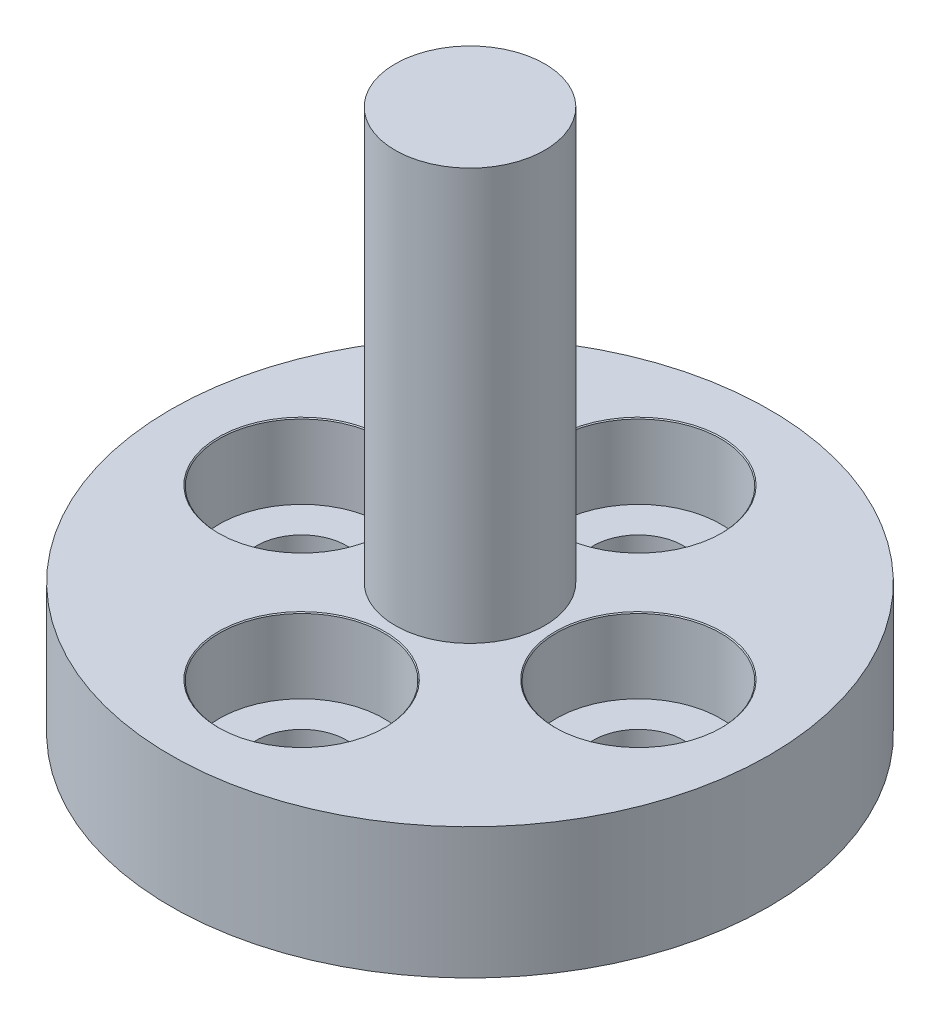
ISO-10303-21;
HEADER;
FILE_DESCRIPTION(('STEP AP214'),'2;1');
FILE_NAME('part.step','',(''),(''),'','','');
FILE_SCHEMA(('AUTOMOTIVE_DESIGN { 1 0 10303 214 1 1 1 1 }'));
ENDSEC;
DATA;
#1=APPLICATION_CONTEXT('core data for automotive mechanical design processes');
#2=APPLICATION_PROTOCOL_DEFINITION('international standard','automotive_design',2000,#1);
#3=PRODUCT_CONTEXT('',#1,'mechanical');
#4=PRODUCT('Part','Part','',(#3));
#5=PRODUCT_RELATED_PRODUCT_CATEGORY('part','',(#4));
#6=PRODUCT_DEFINITION_FORMATION('','',#4);
#7=PRODUCT_DEFINITION_CONTEXT('part definition',#1,'design');
#8=PRODUCT_DEFINITION('design','',#6,#7);
#9=PRODUCT_DEFINITION_SHAPE('','',#8);
#10=(LENGTH_UNIT() NAMED_UNIT(*) SI_UNIT(.MILLI.,.METRE.));
#11=(NAMED_UNIT(*) PLANE_ANGLE_UNIT() SI_UNIT($,.RADIAN.));
#12=(NAMED_UNIT(*) SI_UNIT($,.STERADIAN.) SOLID_ANGLE_UNIT());
#13=UNCERTAINTY_MEASURE_WITH_UNIT(LENGTH_MEASURE(1.E-05),#10,'distance_accuracy_value','');
#14=(GEOMETRIC_REPRESENTATION_CONTEXT(3) GLOBAL_UNCERTAINTY_ASSIGNED_CONTEXT((#13)) GLOBAL_UNIT_ASSIGNED_CONTEXT((#10,
#11,#12)) REPRESENTATION_CONTEXT('',''));
#15=CARTESIAN_POINT('',(0.,0.,0.));
#16=DIRECTION('',(0.,0.,1.));
#17=DIRECTION('',(1.,0.,0.));
#18=AXIS2_PLACEMENT_3D('',#15,#16,#17);
#19=CARTESIAN_POINT('',(0.,0.,0.));
#20=DIRECTION('',(0.,1.,0.));
#21=DIRECTION('',(-1.,0.,0.));
#22=AXIS2_PLACEMENT_3D('',#19,#20,#21);
#23=PLANE('',#22);
#24=CARTESIAN_POINT('',(-4.5,0.,0.));
#25=DIRECTION('',(0.,1.,0.));
#26=DIRECTION('',(0.,0.,1.));
#27=AXIS2_PLACEMENT_3D('',#24,#25,#26);
#28=CIRCLE('',#27,1.2);
#29=CARTESIAN_POINT('',(-4.5,0.,1.2));
#30=VERTEX_POINT('',#29);
#31=EDGE_CURVE('E101',#30,#30,#28,.T.);
#32=ORIENTED_EDGE('',*,*,#31,.T.);
#33=EDGE_LOOP('',(#32));
#34=FACE_BOUND('',#33,.T.);
#35=CARTESIAN_POINT('',(0.,0.,-4.5));
#36=DIRECTION('',(0.,1.,0.));
#37=DIRECTION('',(0.,0.,1.));
#38=AXIS2_PLACEMENT_3D('',#35,#36,#37);
#39=CIRCLE('',#38,1.2);
#40=CARTESIAN_POINT('',(0.,0.,-3.3));
#41=VERTEX_POINT('',#40);
#42=EDGE_CURVE('E86',#41,#41,#39,.T.);
#43=ORIENTED_EDGE('',*,*,#42,.T.);
#44=EDGE_LOOP('',(#43));
#45=FACE_BOUND('',#44,.T.);
#46=CARTESIAN_POINT('',(4.5,0.,0.));
#47=DIRECTION('',(0.,1.,0.));
#48=DIRECTION('',(0.,0.,1.));
#49=AXIS2_PLACEMENT_3D('',#46,#47,#48);
#50=CIRCLE('',#49,1.2);
#51=CARTESIAN_POINT('',(4.5,0.,1.2));
#52=VERTEX_POINT('',#51);
#53=EDGE_CURVE('E71',#52,#52,#50,.T.);
#54=ORIENTED_EDGE('',*,*,#53,.T.);
#55=EDGE_LOOP('',(#54));
#56=FACE_BOUND('',#55,.T.);
#57=CARTESIAN_POINT('',(0.,0.,4.5));
#58=DIRECTION('',(0.,1.,0.));
#59=DIRECTION('',(0.,0.,1.));
#60=AXIS2_PLACEMENT_3D('',#57,#58,#59);
#61=CIRCLE('',#60,1.2);
#62=CARTESIAN_POINT('',(0.,0.,5.7));
#63=VERTEX_POINT('',#62);
#64=EDGE_CURVE('E56',#63,#63,#61,.T.);
#65=ORIENTED_EDGE('',*,*,#64,.T.);
#66=EDGE_LOOP('',(#65));
#67=FACE_BOUND('',#66,.T.);
#68=CARTESIAN_POINT('',(0.,0.,0.));
#69=DIRECTION('',(0.,1.,0.));
#70=DIRECTION('',(-1.,0.,0.));
#71=AXIS2_PLACEMENT_3D('',#68,#69,#70);
#72=CIRCLE('',#71,8.);
#73=CARTESIAN_POINT('',(-8.,0.,0.));
#74=VERTEX_POINT('',#73);
#75=EDGE_CURVE('E10',#74,#74,#72,.T.);
#76=ORIENTED_EDGE('',*,*,#75,.F.);
#77=EDGE_LOOP('',(#76));
#78=FACE_BOUND('',#77,.T.);
#79=ADVANCED_FACE('F37',(#34,#45,#56,#67,#78),#23,.F.);
#80=CARTESIAN_POINT('',(0.,14.5,0.));
#81=DIRECTION('',(0.,1.,0.));
#82=DIRECTION('',(-1.,0.,0.));
#83=AXIS2_PLACEMENT_3D('',#80,#81,#82);
#84=CYLINDRICAL_SURFACE('',#83,8.);
#85=CARTESIAN_POINT('',(0.,3.5,0.));
#86=DIRECTION('',(0.,1.,0.));
#87=DIRECTION('',(-1.,0.,0.));
#88=AXIS2_PLACEMENT_3D('',#85,#86,#87);
#89=CIRCLE('',#88,8.);
#90=CARTESIAN_POINT('',(-8.,3.5,0.));
#91=VERTEX_POINT('',#90);
#92=EDGE_CURVE('E43',#91,#91,#89,.T.);
#93=ORIENTED_EDGE('',*,*,#92,.F.);
#94=EDGE_LOOP('',(#93));
#95=FACE_BOUND('',#94,.T.);
#96=ORIENTED_EDGE('',*,*,#75,.T.);
#97=EDGE_LOOP('',(#96));
#98=FACE_BOUND('',#97,.T.);
#99=ADVANCED_FACE('F123',(#95,#98),#84,.T.);
#100=CARTESIAN_POINT('',(8.,3.5,0.));
#101=DIRECTION('',(0.,-1.,0.));
#102=DIRECTION('',(1.,0.,0.));
#103=AXIS2_PLACEMENT_3D('',#100,#101,#102);
#104=PLANE('',#103);
#105=CARTESIAN_POINT('',(-4.5,3.5,0.));
#106=DIRECTION('',(0.,1.,0.));
#107=DIRECTION('',(0.,0.,1.));
#108=AXIS2_PLACEMENT_3D('',#105,#106,#107);
#109=CIRCLE('',#108,2.225);
#110=CARTESIAN_POINT('',(-4.5,3.5,2.225));
#111=VERTEX_POINT('',#110);
#112=EDGE_CURVE('E113',#111,#111,#109,.T.);
#113=ORIENTED_EDGE('',*,*,#112,.F.);
#114=EDGE_LOOP('',(#113));
#115=FACE_BOUND('',#114,.T.);
#116=CARTESIAN_POINT('',(0.,3.5,-4.5));
#117=DIRECTION('',(0.,1.,0.));
#118=DIRECTION('',(0.,0.,1.));
#119=AXIS2_PLACEMENT_3D('',#116,#117,#118);
#120=CIRCLE('',#119,2.225);
#121=CARTESIAN_POINT('',(0.,3.5,-2.275));
#122=VERTEX_POINT('',#121);
#123=EDGE_CURVE('E98',#122,#122,#120,.T.);
#124=ORIENTED_EDGE('',*,*,#123,.F.);
#125=EDGE_LOOP('',(#124));
#126=FACE_BOUND('',#125,.T.);
#127=CARTESIAN_POINT('',(4.5,3.5,0.));
#128=DIRECTION('',(0.,1.,0.));
#129=DIRECTION('',(0.,0.,1.));
#130=AXIS2_PLACEMENT_3D('',#127,#128,#129);
#131=CIRCLE('',#130,2.225);
#132=CARTESIAN_POINT('',(4.5,3.5,2.225));
#133=VERTEX_POINT('',#132);
#134=EDGE_CURVE('E83',#133,#133,#131,.T.);
#135=ORIENTED_EDGE('',*,*,#134,.F.);
#136=EDGE_LOOP('',(#135));
#137=FACE_BOUND('',#136,.T.);
#138=CARTESIAN_POINT('',(0.,3.5,4.5));
#139=DIRECTION('',(0.,1.,0.));
#140=DIRECTION('',(0.,0.,1.));
#141=AXIS2_PLACEMENT_3D('',#138,#139,#140);
#142=CIRCLE('',#141,2.225);
#143=CARTESIAN_POINT('',(0.,3.5,6.725));
#144=VERTEX_POINT('',#143);
#145=EDGE_CURVE('E68',#144,#144,#142,.T.);
#146=ORIENTED_EDGE('',*,*,#145,.F.);
#147=EDGE_LOOP('',(#146));
#148=FACE_BOUND('',#147,.T.);
#149=CARTESIAN_POINT('',(0.,3.5,0.));
#150=DIRECTION('',(0.,1.,0.));
#151=DIRECTION('',(-1.,0.,0.));
#152=AXIS2_PLACEMENT_3D('',#149,#150,#151);
#153=CIRCLE('',#152,2.);
#154=CARTESIAN_POINT('',(-2.,3.5,0.));
#155=VERTEX_POINT('',#154);
#156=EDGE_CURVE('E47',#155,#155,#153,.T.);
#157=ORIENTED_EDGE('',*,*,#156,.F.);
#158=EDGE_LOOP('',(#157));
#159=FACE_BOUND('',#158,.T.);
#160=ORIENTED_EDGE('',*,*,#92,.T.);
#161=EDGE_LOOP('',(#160));
#162=FACE_BOUND('',#161,.T.);
#163=ADVANCED_FACE('F119',(#115,#126,#137,#148,#159,#162),#104,.F.);
#164=CARTESIAN_POINT('',(0.,14.5,0.));
#165=DIRECTION('',(0.,1.,0.));
#166=DIRECTION('',(-1.,0.,0.));
#167=AXIS2_PLACEMENT_3D('',#164,#165,#166);
#168=CYLINDRICAL_SURFACE('',#167,2.);
#169=CARTESIAN_POINT('',(0.,14.5,0.));
#170=DIRECTION('',(0.,1.,0.));
#171=DIRECTION('',(-1.,0.,0.));
#172=AXIS2_PLACEMENT_3D('',#169,#170,#171);
#173=CIRCLE('',#172,2.);
#174=CARTESIAN_POINT('',(-2.,14.5,0.));
#175=VERTEX_POINT('',#174);
#176=EDGE_CURVE('E51',#175,#175,#173,.T.);
#177=ORIENTED_EDGE('',*,*,#176,.F.);
#178=EDGE_LOOP('',(#177));
#179=FACE_BOUND('',#178,.T.);
#180=ORIENTED_EDGE('',*,*,#156,.T.);
#181=EDGE_LOOP('',(#180));
#182=FACE_BOUND('',#181,.T.);
#183=ADVANCED_FACE('F122',(#179,#182),#168,.T.);
#184=CARTESIAN_POINT('',(2.,14.5,0.));
#185=DIRECTION('',(0.,-1.,0.));
#186=DIRECTION('',(1.,0.,0.));
#187=AXIS2_PLACEMENT_3D('',#184,#185,#186);
#188=PLANE('',#187);
#189=ORIENTED_EDGE('',*,*,#176,.T.);
#190=EDGE_LOOP('',(#189));
#191=FACE_BOUND('',#190,.T.);
#192=ADVANCED_FACE('F134',(#191),#188,.F.);
#193=CARTESIAN_POINT('',(0.,3.5,4.5));
#194=DIRECTION('',(0.,1.,0.));
#195=DIRECTION('',(0.,0.,1.));
#196=AXIS2_PLACEMENT_3D('',#193,#194,#195);
#197=CYLINDRICAL_SURFACE('',#196,1.2);
#198=ORIENTED_EDGE('',*,*,#64,.F.);
#199=EDGE_LOOP('',(#198));
#200=FACE_BOUND('',#199,.T.);
#201=CARTESIAN_POINT('',(0.,1.5,4.5));
#202=DIRECTION('',(0.,1.,0.));
#203=DIRECTION('',(0.,0.,1.));
#204=AXIS2_PLACEMENT_3D('',#201,#202,#203);
#205=CIRCLE('',#204,1.2);
#206=CARTESIAN_POINT('',(0.,1.5,5.7));
#207=VERTEX_POINT('',#206);
#208=EDGE_CURVE('E59',#207,#207,#205,.T.);
#209=ORIENTED_EDGE('',*,*,#208,.T.);
#210=EDGE_LOOP('',(#209));
#211=FACE_BOUND('',#210,.T.);
#212=ADVANCED_FACE('F141',(#200,#211),#197,.F.);
#213=CARTESIAN_POINT('',(2.2,1.5,4.5));
#214=DIRECTION('',(0.,-1.,0.));
#215=DIRECTION('',(0.,0.,-1.));
#216=AXIS2_PLACEMENT_3D('',#213,#214,#215);
#217=PLANE('',#216);
#218=ORIENTED_EDGE('',*,*,#208,.F.);
#219=EDGE_LOOP('',(#218));
#220=FACE_BOUND('',#219,.T.);
#221=CARTESIAN_POINT('',(0.,1.5,4.5));
#222=DIRECTION('',(0.,1.,0.));
#223=DIRECTION('',(0.,0.,1.));
#224=AXIS2_PLACEMENT_3D('',#221,#222,#223);
#225=CIRCLE('',#224,2.2);
#226=CARTESIAN_POINT('',(0.,1.5,6.7));
#227=VERTEX_POINT('',#226);
#228=EDGE_CURVE('E62',#227,#227,#225,.T.);
#229=ORIENTED_EDGE('',*,*,#228,.T.);
#230=EDGE_LOOP('',(#229));
#231=FACE_BOUND('',#230,.T.);
#232=ADVANCED_FACE('F161',(#220,#231),#217,.F.);
#233=CARTESIAN_POINT('',(0.,3.5,4.5));
#234=DIRECTION('',(0.,1.,0.));
#235=DIRECTION('',(0.,0.,1.));
#236=AXIS2_PLACEMENT_3D('',#233,#234,#235);
#237=CYLINDRICAL_SURFACE('',#236,2.2);
#238=ORIENTED_EDGE('',*,*,#228,.F.);
#239=EDGE_LOOP('',(#238));
#240=FACE_BOUND('',#239,.T.);
#241=CARTESIAN_POINT('',(0.,3.475,4.5));
#242=DIRECTION('',(0.,1.,0.));
#243=DIRECTION('',(0.,0.,1.));
#244=AXIS2_PLACEMENT_3D('',#241,#242,#243);
#245=CIRCLE('',#244,2.2);
#246=CARTESIAN_POINT('',(0.,3.475,6.7));
#247=VERTEX_POINT('',#246);
#248=EDGE_CURVE('E65',#247,#247,#245,.T.);
#249=ORIENTED_EDGE('',*,*,#248,.T.);
#250=EDGE_LOOP('',(#249));
#251=FACE_BOUND('',#250,.T.);
#252=ADVANCED_FACE('F167',(#240,#251),#237,.F.);
#253=CARTESIAN_POINT('',(0.,3.5,4.5));
#254=DIRECTION('',(0.,1.,0.));
#255=DIRECTION('',(0.,0.,1.));
#256=AXIS2_PLACEMENT_3D('',#253,#254,#255);
#257=CONICAL_SURFACE('',#256,2.225,0.785398163397457);
#258=ORIENTED_EDGE('',*,*,#248,.F.);
#259=EDGE_LOOP('',(#258));
#260=FACE_BOUND('',#259,.T.);
#261=ORIENTED_EDGE('',*,*,#145,.T.);
#262=EDGE_LOOP('',(#261));
#263=FACE_BOUND('',#262,.T.);
#264=ADVANCED_FACE('F173',(#260,#263),#257,.F.);
#265=CARTESIAN_POINT('',(4.5,3.5,0.));
#266=DIRECTION('',(0.,1.,0.));
#267=DIRECTION('',(0.,0.,1.));
#268=AXIS2_PLACEMENT_3D('',#265,#266,#267);
#269=CYLINDRICAL_SURFACE('',#268,1.2);
#270=ORIENTED_EDGE('',*,*,#53,.F.);
#271=EDGE_LOOP('',(#270));
#272=FACE_BOUND('',#271,.T.);
#273=CARTESIAN_POINT('',(4.5,1.5,0.));
#274=DIRECTION('',(0.,1.,0.));
#275=DIRECTION('',(0.,0.,1.));
#276=AXIS2_PLACEMENT_3D('',#273,#274,#275);
#277=CIRCLE('',#276,1.2);
#278=CARTESIAN_POINT('',(4.5,1.5,1.2));
#279=VERTEX_POINT('',#278);
#280=EDGE_CURVE('E74',#279,#279,#277,.T.);
#281=ORIENTED_EDGE('',*,*,#280,.T.);
#282=EDGE_LOOP('',(#281));
#283=FACE_BOUND('',#282,.T.);
#284=ADVANCED_FACE('F179',(#272,#283),#269,.F.);
#285=CARTESIAN_POINT('',(6.7,1.5,0.));
#286=DIRECTION('',(0.,-1.,0.));
#287=DIRECTION('',(0.,0.,-1.));
#288=AXIS2_PLACEMENT_3D('',#285,#286,#287);
#289=PLANE('',#288);
#290=ORIENTED_EDGE('',*,*,#280,.F.);
#291=EDGE_LOOP('',(#290));
#292=FACE_BOUND('',#291,.T.);
#293=CARTESIAN_POINT('',(4.5,1.5,0.));
#294=DIRECTION('',(0.,1.,0.));
#295=DIRECTION('',(0.,0.,1.));
#296=AXIS2_PLACEMENT_3D('',#293,#294,#295);
#297=CIRCLE('',#296,2.2);
#298=CARTESIAN_POINT('',(4.5,1.5,2.2));
#299=VERTEX_POINT('',#298);
#300=EDGE_CURVE('E77',#299,#299,#297,.T.);
#301=ORIENTED_EDGE('',*,*,#300,.T.);
#302=EDGE_LOOP('',(#301));
#303=FACE_BOUND('',#302,.T.);
#304=ADVANCED_FACE('F184',(#292,#303),#289,.F.);
#305=CARTESIAN_POINT('',(4.5,3.5,0.));
#306=DIRECTION('',(0.,1.,0.));
#307=DIRECTION('',(0.,0.,1.));
#308=AXIS2_PLACEMENT_3D('',#305,#306,#307);
#309=CYLINDRICAL_SURFACE('',#308,2.2);
#310=ORIENTED_EDGE('',*,*,#300,.F.);
#311=EDGE_LOOP('',(#310));
#312=FACE_BOUND('',#311,.T.);
#313=CARTESIAN_POINT('',(4.5,3.475,0.));
#314=DIRECTION('',(0.,1.,0.));
#315=DIRECTION('',(0.,0.,1.));
#316=AXIS2_PLACEMENT_3D('',#313,#314,#315);
#317=CIRCLE('',#316,2.2);
#318=CARTESIAN_POINT('',(4.5,3.475,2.2));
#319=VERTEX_POINT('',#318);
#320=EDGE_CURVE('E80',#319,#319,#317,.T.);
#321=ORIENTED_EDGE('',*,*,#320,.T.);
#322=EDGE_LOOP('',(#321));
#323=FACE_BOUND('',#322,.T.);
#324=ADVANCED_FACE('F190',(#312,#323),#309,.F.);
#325=CARTESIAN_POINT('',(4.5,3.5,0.));
#326=DIRECTION('',(0.,1.,0.));
#327=DIRECTION('',(0.,0.,1.));
#328=AXIS2_PLACEMENT_3D('',#325,#326,#327);
#329=CONICAL_SURFACE('',#328,2.225,0.785398163397466);
#330=ORIENTED_EDGE('',*,*,#320,.F.);
#331=EDGE_LOOP('',(#330));
#332=FACE_BOUND('',#331,.T.);
#333=ORIENTED_EDGE('',*,*,#134,.T.);
#334=EDGE_LOOP('',(#333));
#335=FACE_BOUND('',#334,.T.);
#336=ADVANCED_FACE('F194',(#332,#335),#329,.F.);
#337=CARTESIAN_POINT('',(0.,3.5,-4.5));
#338=DIRECTION('',(0.,1.,0.));
#339=DIRECTION('',(0.,0.,1.));
#340=AXIS2_PLACEMENT_3D('',#337,#338,#339);
#341=CYLINDRICAL_SURFACE('',#340,1.2);
#342=ORIENTED_EDGE('',*,*,#42,.F.);
#343=EDGE_LOOP('',(#342));
#344=FACE_BOUND('',#343,.T.);
#345=CARTESIAN_POINT('',(0.,1.5,-4.5));
#346=DIRECTION('',(0.,1.,0.));
#347=DIRECTION('',(0.,0.,1.));
#348=AXIS2_PLACEMENT_3D('',#345,#346,#347);
#349=CIRCLE('',#348,1.2);
#350=CARTESIAN_POINT('',(0.,1.5,-3.3));
#351=VERTEX_POINT('',#350);
#352=EDGE_CURVE('E89',#351,#351,#349,.T.);
#353=ORIENTED_EDGE('',*,*,#352,.T.);
#354=EDGE_LOOP('',(#353));
#355=FACE_BOUND('',#354,.T.);
#356=ADVANCED_FACE('F198',(#344,#355),#341,.F.);
#357=CARTESIAN_POINT('',(2.2,1.5,-4.5));
#358=DIRECTION('',(0.,-1.,0.));
#359=DIRECTION('',(0.,0.,-1.));
#360=AXIS2_PLACEMENT_3D('',#357,#358,#359);
#361=PLANE('',#360);
#362=ORIENTED_EDGE('',*,*,#352,.F.);
#363=EDGE_LOOP('',(#362));
#364=FACE_BOUND('',#363,.T.);
#365=CARTESIAN_POINT('',(0.,1.5,-4.5));
#366=DIRECTION('',(0.,1.,0.));
#367=DIRECTION('',(0.,0.,1.));
#368=AXIS2_PLACEMENT_3D('',#365,#366,#367);
#369=CIRCLE('',#368,2.2);
#370=CARTESIAN_POINT('',(0.,1.5,-2.3));
#371=VERTEX_POINT('',#370);
#372=EDGE_CURVE('E92',#371,#371,#369,.T.);
#373=ORIENTED_EDGE('',*,*,#372,.T.);
#374=EDGE_LOOP('',(#373));
#375=FACE_BOUND('',#374,.T.);
#376=ADVANCED_FACE('F202',(#364,#375),#361,.F.);
#377=CARTESIAN_POINT('',(0.,3.5,-4.5));
#378=DIRECTION('',(0.,1.,0.));
#379=DIRECTION('',(0.,0.,1.));
#380=AXIS2_PLACEMENT_3D('',#377,#378,#379);
#381=CYLINDRICAL_SURFACE('',#380,2.2);
#382=ORIENTED_EDGE('',*,*,#372,.F.);
#383=EDGE_LOOP('',(#382));
#384=FACE_BOUND('',#383,.T.);
#385=CARTESIAN_POINT('',(0.,3.475,-4.5));
#386=DIRECTION('',(0.,1.,0.));
#387=DIRECTION('',(0.,0.,1.));
#388=AXIS2_PLACEMENT_3D('',#385,#386,#387);
#389=CIRCLE('',#388,2.2);
#390=CARTESIAN_POINT('',(0.,3.475,-2.3));
#391=VERTEX_POINT('',#390);
#392=EDGE_CURVE('E95',#391,#391,#389,.T.);
#393=ORIENTED_EDGE('',*,*,#392,.T.);
#394=EDGE_LOOP('',(#393));
#395=FACE_BOUND('',#394,.T.);
#396=ADVANCED_FACE('F206',(#384,#395),#381,.F.);
#397=CARTESIAN_POINT('',(0.,3.5,-4.5));
#398=DIRECTION('',(0.,1.,0.));
#399=DIRECTION('',(0.,0.,1.));
#400=AXIS2_PLACEMENT_3D('',#397,#398,#399);
#401=CONICAL_SURFACE('',#400,2.225,0.785398163397457);
#402=ORIENTED_EDGE('',*,*,#392,.F.);
#403=EDGE_LOOP('',(#402));
#404=FACE_BOUND('',#403,.T.);
#405=ORIENTED_EDGE('',*,*,#123,.T.);
#406=EDGE_LOOP('',(#405));
#407=FACE_BOUND('',#406,.T.);
#408=ADVANCED_FACE('F210',(#404,#407),#401,.F.);
#409=CARTESIAN_POINT('',(-4.5,3.5,0.));
#410=DIRECTION('',(0.,1.,0.));
#411=DIRECTION('',(0.,0.,1.));
#412=AXIS2_PLACEMENT_3D('',#409,#410,#411);
#413=CYLINDRICAL_SURFACE('',#412,1.2);
#414=ORIENTED_EDGE('',*,*,#31,.F.);
#415=EDGE_LOOP('',(#414));
#416=FACE_BOUND('',#415,.T.);
#417=CARTESIAN_POINT('',(-4.5,1.5,0.));
#418=DIRECTION('',(0.,1.,0.));
#419=DIRECTION('',(0.,0.,1.));
#420=AXIS2_PLACEMENT_3D('',#417,#418,#419);
#421=CIRCLE('',#420,1.2);
#422=CARTESIAN_POINT('',(-4.5,1.5,1.2));
#423=VERTEX_POINT('',#422);
#424=EDGE_CURVE('E104',#423,#423,#421,.T.);
#425=ORIENTED_EDGE('',*,*,#424,.T.);
#426=EDGE_LOOP('',(#425));
#427=FACE_BOUND('',#426,.T.);
#428=ADVANCED_FACE('F214',(#416,#427),#413,.F.);
#429=CARTESIAN_POINT('',(-2.3,1.5,0.));
#430=DIRECTION('',(0.,-1.,0.));
#431=DIRECTION('',(0.,0.,-1.));
#432=AXIS2_PLACEMENT_3D('',#429,#430,#431);
#433=PLANE('',#432);
#434=ORIENTED_EDGE('',*,*,#424,.F.);
#435=EDGE_LOOP('',(#434));
#436=FACE_BOUND('',#435,.T.);
#437=CARTESIAN_POINT('',(-4.5,1.5,0.));
#438=DIRECTION('',(0.,1.,0.));
#439=DIRECTION('',(0.,0.,1.));
#440=AXIS2_PLACEMENT_3D('',#437,#438,#439);
#441=CIRCLE('',#440,2.2);
#442=CARTESIAN_POINT('',(-4.5,1.5,2.2));
#443=VERTEX_POINT('',#442);
#444=EDGE_CURVE('E107',#443,#443,#441,.T.);
#445=ORIENTED_EDGE('',*,*,#444,.T.);
#446=EDGE_LOOP('',(#445));
#447=FACE_BOUND('',#446,.T.);
#448=ADVANCED_FACE('F218',(#436,#447),#433,.F.);
#449=CARTESIAN_POINT('',(-4.5,3.5,0.));
#450=DIRECTION('',(0.,1.,0.));
#451=DIRECTION('',(0.,0.,1.));
#452=AXIS2_PLACEMENT_3D('',#449,#450,#451);
#453=CYLINDRICAL_SURFACE('',#452,2.2);
#454=ORIENTED_EDGE('',*,*,#444,.F.);
#455=EDGE_LOOP('',(#454));
#456=FACE_BOUND('',#455,.T.);
#457=CARTESIAN_POINT('',(-4.5,3.475,0.));
#458=DIRECTION('',(0.,1.,0.));
#459=DIRECTION('',(0.,0.,1.));
#460=AXIS2_PLACEMENT_3D('',#457,#458,#459);
#461=CIRCLE('',#460,2.2);
#462=CARTESIAN_POINT('',(-4.5,3.475,2.2));
#463=VERTEX_POINT('',#462);
#464=EDGE_CURVE('E110',#463,#463,#461,.T.);
#465=ORIENTED_EDGE('',*,*,#464,.T.);
#466=EDGE_LOOP('',(#465));
#467=FACE_BOUND('',#466,.T.);
#468=ADVANCED_FACE('F222',(#456,#467),#453,.F.);
#469=CARTESIAN_POINT('',(-4.5,3.5,0.));
#470=DIRECTION('',(0.,1.,0.));
#471=DIRECTION('',(0.,0.,1.));
#472=AXIS2_PLACEMENT_3D('',#469,#470,#471);
#473=CONICAL_SURFACE('',#472,2.225,0.785398163397457);
#474=ORIENTED_EDGE('',*,*,#464,.F.);
#475=EDGE_LOOP('',(#474));
#476=FACE_BOUND('',#475,.T.);
#477=ORIENTED_EDGE('',*,*,#112,.T.);
#478=EDGE_LOOP('',(#477));
#479=FACE_BOUND('',#478,.T.);
#480=ADVANCED_FACE('F117',(#476,#479),#473,.F.);
#481=CLOSED_SHELL('',(#79,#99,#163,#183,#192,#212,#232,#252,#264,#284,#304,#324,#336,#356,#376,
#396,#408,#428,#448,#468,#480));
#482=MANIFOLD_SOLID_BREP('B2',#481);
#483=ADVANCED_BREP_SHAPE_REPRESENTATION('',(#18,#482),#14);
#484=SHAPE_DEFINITION_REPRESENTATION(#9,#483);
ENDSEC;
END-ISO-10303-21;
